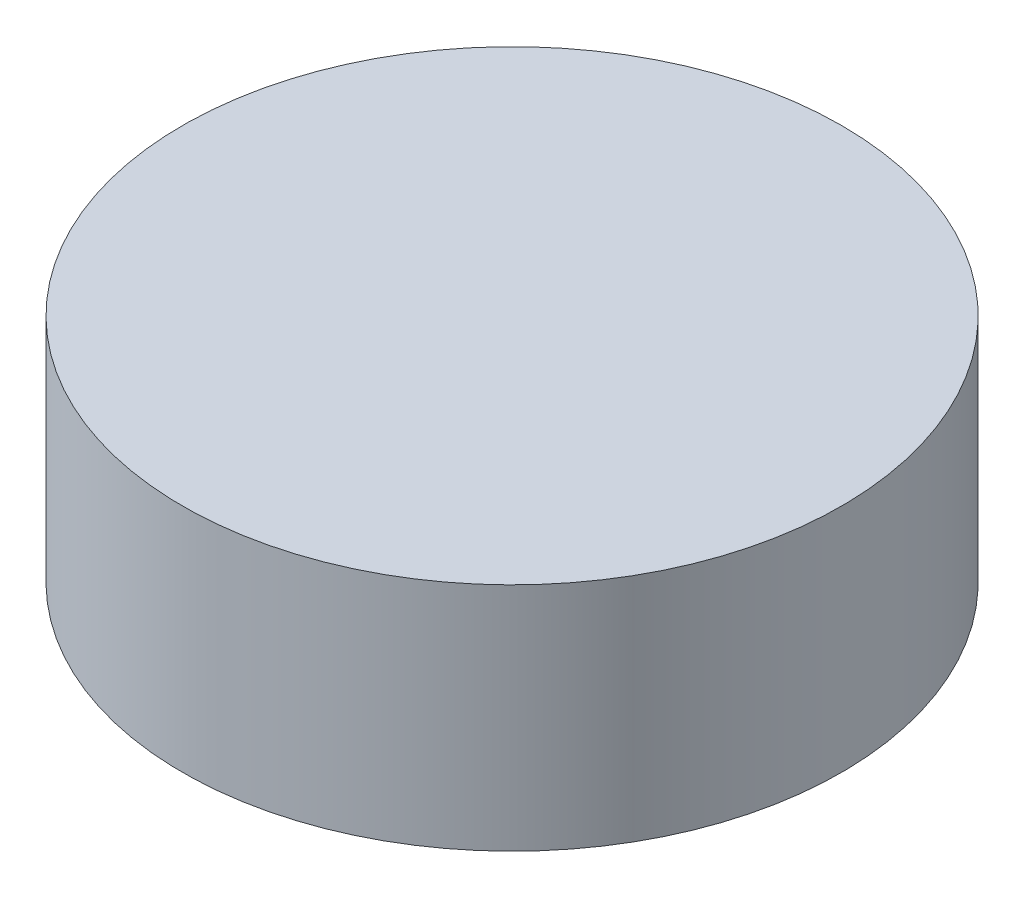
ISO-10303-21;
HEADER;
FILE_DESCRIPTION(('STEP AP214'),'2;1');
FILE_NAME('part.step','',(''),(''),'','','');
FILE_SCHEMA(('AUTOMOTIVE_DESIGN { 1 0 10303 214 1 1 1 1 }'));
ENDSEC;
DATA;
#1=APPLICATION_CONTEXT('core data for automotive mechanical design processes');
#2=APPLICATION_PROTOCOL_DEFINITION('international standard','automotive_design',2000,#1);
#3=PRODUCT_CONTEXT('',#1,'mechanical');
#4=PRODUCT('Part','Part','',(#3));
#5=PRODUCT_RELATED_PRODUCT_CATEGORY('part','',(#4));
#6=PRODUCT_DEFINITION_FORMATION('','',#4);
#7=PRODUCT_DEFINITION_CONTEXT('part definition',#1,'design');
#8=PRODUCT_DEFINITION('design','',#6,#7);
#9=PRODUCT_DEFINITION_SHAPE('','',#8);
#10=(LENGTH_UNIT() NAMED_UNIT(*) SI_UNIT(.MILLI.,.METRE.));
#11=(NAMED_UNIT(*) PLANE_ANGLE_UNIT() SI_UNIT($,.RADIAN.));
#12=(NAMED_UNIT(*) SI_UNIT($,.STERADIAN.) SOLID_ANGLE_UNIT());
#13=UNCERTAINTY_MEASURE_WITH_UNIT(LENGTH_MEASURE(1.E-05),#10,'distance_accuracy_value','');
#14=(GEOMETRIC_REPRESENTATION_CONTEXT(3) GLOBAL_UNCERTAINTY_ASSIGNED_CONTEXT((#13)) GLOBAL_UNIT_ASSIGNED_CONTEXT((#10,
#11,#12)) REPRESENTATION_CONTEXT('',''));
#15=CARTESIAN_POINT('',(0.,0.,0.));
#16=DIRECTION('',(0.,0.,1.));
#17=DIRECTION('',(1.,0.,0.));
#18=AXIS2_PLACEMENT_3D('',#15,#16,#17);
#19=CARTESIAN_POINT('',(150.,32.,0.));
#20=DIRECTION('',(0.,-1.,0.));
#21=DIRECTION('',(0.,0.,-1.));
#22=AXIS2_PLACEMENT_3D('',#19,#20,#21);
#23=CYLINDRICAL_SURFACE('',#22,20.);
#24=CARTESIAN_POINT('',(150.,32.,0.));
#25=DIRECTION('',(0.,1.,0.));
#26=DIRECTION('',(0.,0.,1.));
#27=AXIS2_PLACEMENT_3D('',#24,#25,#26);
#28=CIRCLE('',#27,20.);
#29=CARTESIAN_POINT('',(150.,32.,-20.));
#30=VERTEX_POINT('',#29);
#31=EDGE_CURVE('E10',#30,#30,#28,.T.);
#32=CARTESIAN_POINT('',(150.,18.,0.));
#33=DIRECTION('',(0.,1.,0.));
#34=DIRECTION('',(0.,0.,1.));
#35=AXIS2_PLACEMENT_3D('',#32,#33,#34);
#36=CIRCLE('',#35,20.);
#37=CARTESIAN_POINT('',(150.,18.,-20.));
#38=VERTEX_POINT('',#37);
#39=EDGE_CURVE('E40',#38,#38,#36,.T.);
#40=CARTESIAN_POINT('',(150.,32.,-20.));
#41=CARTESIAN_POINT('',(150.,31.8541666666667,-20.));
#42=CARTESIAN_POINT('',(150.,31.7083333333333,-20.));
#43=CARTESIAN_POINT('',(150.,31.4166666666667,-20.));
#44=CARTESIAN_POINT('',(150.,31.2708333333333,-20.));
#45=CARTESIAN_POINT('',(150.,30.9791666666667,-20.));
#46=CARTESIAN_POINT('',(150.,30.8333333333333,-20.));
#47=CARTESIAN_POINT('',(150.,30.5416666666667,-20.));
#48=CARTESIAN_POINT('',(150.,30.3958333333333,-20.));
#49=CARTESIAN_POINT('',(150.,30.1041666666667,-20.));
#50=CARTESIAN_POINT('',(150.,29.9583333333333,-20.));
#51=CARTESIAN_POINT('',(150.,29.6666666666667,-20.));
#52=CARTESIAN_POINT('',(150.,29.5208333333333,-20.));
#53=CARTESIAN_POINT('',(150.,29.2291666666667,-20.));
#54=CARTESIAN_POINT('',(150.,29.0833333333333,-20.));
#55=CARTESIAN_POINT('',(150.,28.7916666666667,-20.));
#56=CARTESIAN_POINT('',(150.,28.6458333333333,-20.));
#57=CARTESIAN_POINT('',(150.,28.3541666666667,-20.));
#58=CARTESIAN_POINT('',(150.,28.2083333333333,-20.));
#59=CARTESIAN_POINT('',(150.,27.9166666666667,-20.));
#60=CARTESIAN_POINT('',(150.,27.7708333333333,-20.));
#61=CARTESIAN_POINT('',(150.,27.4791666666667,-20.));
#62=CARTESIAN_POINT('',(150.,27.3333333333333,-20.));
#63=CARTESIAN_POINT('',(150.,27.0416666666667,-20.));
#64=CARTESIAN_POINT('',(150.,26.8958333333333,-20.));
#65=CARTESIAN_POINT('',(150.,26.6041666666667,-20.));
#66=CARTESIAN_POINT('',(150.,26.4583333333333,-20.));
#67=CARTESIAN_POINT('',(150.,26.1666666666667,-20.));
#68=CARTESIAN_POINT('',(150.,26.0208333333333,-20.));
#69=CARTESIAN_POINT('',(150.,25.7291666666667,-20.));
#70=CARTESIAN_POINT('',(150.,25.5833333333333,-20.));
#71=CARTESIAN_POINT('',(150.,25.2916666666667,-20.));
#72=CARTESIAN_POINT('',(150.,25.1458333333333,-20.));
#73=CARTESIAN_POINT('',(150.,24.8541666666667,-20.));
#74=CARTESIAN_POINT('',(150.,24.7083333333333,-20.));
#75=CARTESIAN_POINT('',(150.,24.4166666666667,-20.));
#76=CARTESIAN_POINT('',(150.,24.2708333333333,-20.));
#77=CARTESIAN_POINT('',(150.,23.9791666666667,-20.));
#78=CARTESIAN_POINT('',(150.,23.8333333333333,-20.));
#79=CARTESIAN_POINT('',(150.,23.5416666666667,-20.));
#80=CARTESIAN_POINT('',(150.,23.3958333333333,-20.));
#81=CARTESIAN_POINT('',(150.,23.1041666666667,-20.));
#82=CARTESIAN_POINT('',(150.,22.9583333333333,-20.));
#83=CARTESIAN_POINT('',(150.,22.6666666666667,-20.));
#84=CARTESIAN_POINT('',(150.,22.5208333333333,-20.));
#85=CARTESIAN_POINT('',(150.,22.2291666666667,-20.));
#86=CARTESIAN_POINT('',(150.,22.0833333333333,-20.));
#87=CARTESIAN_POINT('',(150.,21.7916666666667,-20.));
#88=CARTESIAN_POINT('',(150.,21.6458333333333,-20.));
#89=CARTESIAN_POINT('',(150.,21.3541666666667,-20.));
#90=CARTESIAN_POINT('',(150.,21.2083333333333,-20.));
#91=CARTESIAN_POINT('',(150.,20.9166666666667,-20.));
#92=CARTESIAN_POINT('',(150.,20.7708333333333,-20.));
#93=CARTESIAN_POINT('',(150.,20.4791666666667,-20.));
#94=CARTESIAN_POINT('',(150.,20.3333333333333,-20.));
#95=CARTESIAN_POINT('',(150.,20.0416666666667,-20.));
#96=CARTESIAN_POINT('',(150.,19.8958333333333,-20.));
#97=CARTESIAN_POINT('',(150.,19.6041666666667,-20.));
#98=CARTESIAN_POINT('',(150.,19.4583333333333,-20.));
#99=CARTESIAN_POINT('',(150.,19.1666666666667,-20.));
#100=CARTESIAN_POINT('',(150.,19.0208333333333,-20.));
#101=CARTESIAN_POINT('',(150.,18.7291666666667,-20.));
#102=CARTESIAN_POINT('',(150.,18.5833333333333,-20.));
#103=CARTESIAN_POINT('',(150.,18.2916666666667,-20.));
#104=CARTESIAN_POINT('',(150.,18.1458333333333,-20.));
#105=CARTESIAN_POINT('',(150.,18.,-20.));
#106=B_SPLINE_CURVE_WITH_KNOTS('',3,(#40,#41,#42,#43,#44,#45,#46,#47,#48,#49,#50,#51,#52,#53,
#54,#55,#56,#57,#58,#59,#60,#61,#62,#63,#64,#65,#66,#67,#68,#69,#70,#71,#72,#73,#74,#75,#76,#77,
#78,#79,#80,#81,#82,#83,#84,#85,#86,#87,#88,#89,#90,#91,#92,#93,#94,#95,#96,#97,#98,#99,#100,
#101,#102,#103,#104,#105),.UNSPECIFIED.,.F.,.F.,(4,2,2,2,2,2,2,2,2,2,2,2,2,2,2,2,2,2,2,2,2,2,2,
2,2,2,2,2,2,2,2,2,4),(0.,0.4375,0.875000000000004,1.3125,1.75,2.1875,2.625,3.0625,3.5,3.9375,
4.375,4.8125,5.25,5.6875,6.125,6.5625,7.,7.4375,7.875,8.3125,8.75,9.1875,9.625,10.0625,10.5,
10.9375,11.375,11.8125,12.25,12.6875,13.125,13.5625,14.),.UNSPECIFIED.);
#107=EDGE_CURVE('BSEAM37',#30,#38,#106,.T.);
#108=ORIENTED_EDGE('',*,*,#31,.F.);
#109=ORIENTED_EDGE('',*,*,#39,.T.);
#110=ORIENTED_EDGE('',*,*,#107,.T.);
#111=ORIENTED_EDGE('',*,*,#107,.F.);
#112=EDGE_LOOP('',(#108,#110,#109,#111));
#113=FACE_BOUND('',#112,.T.);
#114=ADVANCED_FACE('F37',(#113),#23,.T.);
#115=CARTESIAN_POINT('',(150.,32.,0.));
#116=DIRECTION('',(0.,1.,0.));
#117=DIRECTION('',(0.,0.,1.));
#118=AXIS2_PLACEMENT_3D('',#115,#116,#117);
#119=PLANE('',#118);
#120=ORIENTED_EDGE('',*,*,#31,.T.);
#121=EDGE_LOOP('',(#120));
#122=FACE_BOUND('',#121,.T.);
#123=ADVANCED_FACE('F54',(#122),#119,.T.);
#124=CARTESIAN_POINT('',(150.,18.,0.));
#125=DIRECTION('',(0.,1.,0.));
#126=DIRECTION('',(0.,0.,1.));
#127=AXIS2_PLACEMENT_3D('',#124,#125,#126);
#128=PLANE('',#127);
#129=ORIENTED_EDGE('',*,*,#39,.F.);
#130=EDGE_LOOP('',(#129));
#131=FACE_BOUND('',#130,.T.);
#132=ADVANCED_FACE('F52',(#131),#128,.F.);
#133=CLOSED_SHELL('',(#114,#123,#132));
#134=MANIFOLD_SOLID_BREP('B2',#133);
#135=ADVANCED_BREP_SHAPE_REPRESENTATION('',(#18,#134),#14);
#136=SHAPE_DEFINITION_REPRESENTATION(#9,#135);
ENDSEC;
END-ISO-10303-21;
